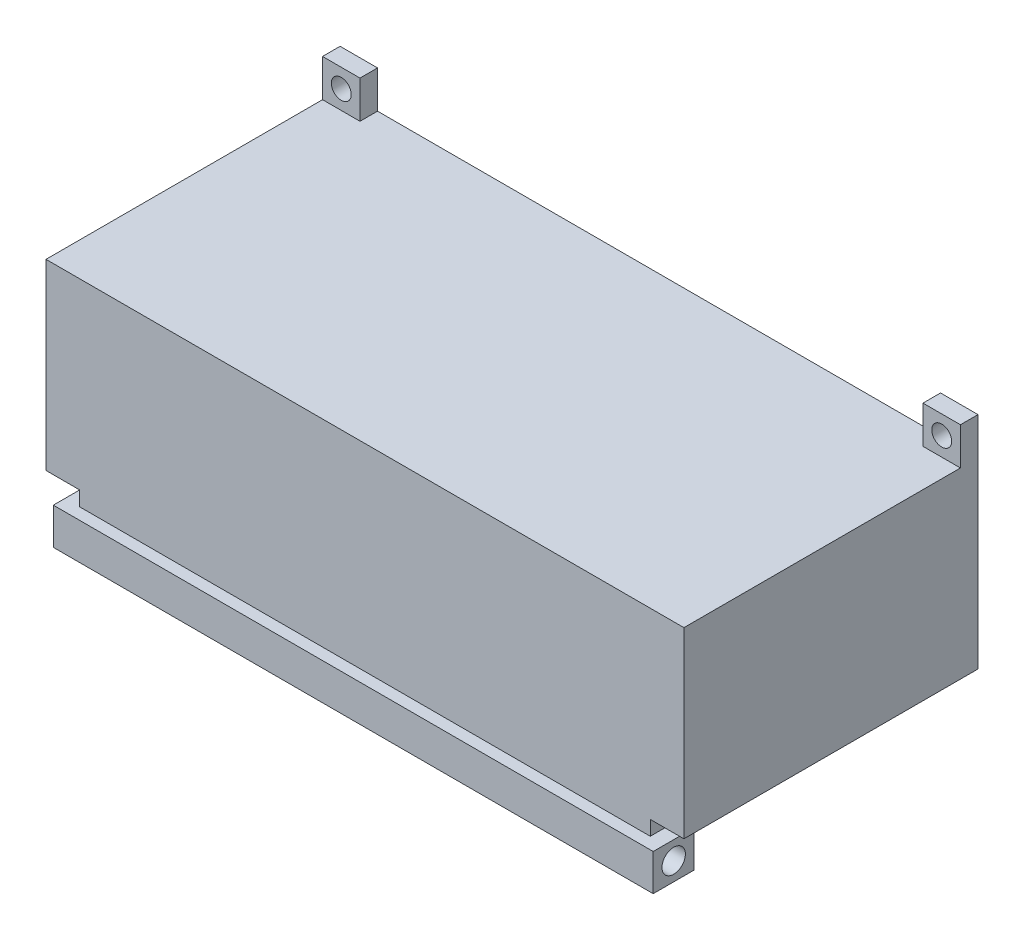
ISO-10303-21;
HEADER;
FILE_DESCRIPTION(('STEP AP214'),'2;1');
FILE_NAME('part.step','',(''),(''),'','','');
FILE_SCHEMA(('AUTOMOTIVE_DESIGN { 1 0 10303 214 1 1 1 1 }'));
ENDSEC;
DATA;
#1=APPLICATION_CONTEXT('core data for automotive mechanical design processes');
#2=APPLICATION_PROTOCOL_DEFINITION('international standard','automotive_design',2000,#1);
#3=PRODUCT_CONTEXT('',#1,'mechanical');
#4=PRODUCT('Part','Part','',(#3));
#5=PRODUCT_RELATED_PRODUCT_CATEGORY('part','',(#4));
#6=PRODUCT_DEFINITION_FORMATION('','',#4);
#7=PRODUCT_DEFINITION_CONTEXT('part definition',#1,'design');
#8=PRODUCT_DEFINITION('design','',#6,#7);
#9=PRODUCT_DEFINITION_SHAPE('','',#8);
#10=(LENGTH_UNIT() NAMED_UNIT(*) SI_UNIT(.MILLI.,.METRE.));
#11=(NAMED_UNIT(*) PLANE_ANGLE_UNIT() SI_UNIT($,.RADIAN.));
#12=(NAMED_UNIT(*) SI_UNIT($,.STERADIAN.) SOLID_ANGLE_UNIT());
#13=UNCERTAINTY_MEASURE_WITH_UNIT(LENGTH_MEASURE(1.E-05),#10,'distance_accuracy_value','');
#14=(GEOMETRIC_REPRESENTATION_CONTEXT(3) GLOBAL_UNCERTAINTY_ASSIGNED_CONTEXT((#13)) GLOBAL_UNIT_ASSIGNED_CONTEXT((#10,
#11,#12)) REPRESENTATION_CONTEXT('',''));
#15=CARTESIAN_POINT('',(0.,0.,0.));
#16=DIRECTION('',(0.,0.,1.));
#17=DIRECTION('',(1.,0.,0.));
#18=AXIS2_PLACEMENT_3D('',#15,#16,#17);
#19=CARTESIAN_POINT('',(0.,152.866347951903,47.25));
#20=DIRECTION('',(0.,0.,-1.));
#21=DIRECTION('',(-1.,0.,0.));
#22=AXIS2_PLACEMENT_3D('',#19,#20,#21);
#23=PLANE('',#22);
#24=DIRECTION('',(0.,-1.,0.));
#25=VECTOR('',#24,1.);
#26=CARTESIAN_POINT('',(8.25,152.866347951903,47.25));
#27=LINE('',#26,#25);
#28=CARTESIAN_POINT('',(8.25,1.8021243444677,47.25));
#29=VERTEX_POINT('',#28);
#30=CARTESIAN_POINT('',(8.25,0.,47.25));
#31=VERTEX_POINT('',#30);
#32=EDGE_CURVE('E252',#29,#31,#27,.T.);
#33=ORIENTED_EDGE('',*,*,#32,.F.);
#34=DIRECTION('',(-1.,0.,0.));
#35=VECTOR('',#34,1.);
#36=CARTESIAN_POINT('',(10.25,1.8021243444677,47.25));
#37=LINE('',#36,#35);
#38=CARTESIAN_POINT('',(10.25,1.8021243444677,47.25));
#39=VERTEX_POINT('',#38);
#40=EDGE_CURVE('E12',#29,#39,#37,.F.);
#41=ORIENTED_EDGE('',*,*,#40,.T.);
#42=DIRECTION('',(0.,1.,0.));
#43=VECTOR('',#42,1.);
#44=CARTESIAN_POINT('',(10.25,152.866347951903,47.25));
#45=LINE('',#44,#43);
#46=CARTESIAN_POINT('',(10.25,4.4478756555323,47.25));
#47=VERTEX_POINT('',#46);
#48=EDGE_CURVE('E237',#39,#47,#45,.T.);
#49=ORIENTED_EDGE('',*,*,#48,.T.);
#50=DIRECTION('',(-1.,0.,0.));
#51=VECTOR('',#50,1.);
#52=CARTESIAN_POINT('',(10.25,4.4478756555323,47.25));
#53=LINE('',#52,#51);
#54=CARTESIAN_POINT('',(8.25,4.4478756555323,47.25));
#55=VERTEX_POINT('',#54);
#56=EDGE_CURVE('E49',#47,#55,#53,.T.);
#57=ORIENTED_EDGE('',*,*,#56,.T.);
#58=CARTESIAN_POINT('',(8.25,37.,47.25));
#59=VERTEX_POINT('',#58);
#60=EDGE_CURVE('E258',#59,#55,#27,.T.);
#61=ORIENTED_EDGE('',*,*,#60,.F.);
#62=DIRECTION('',(-1.,0.,0.));
#63=VECTOR('',#62,1.);
#64=CARTESIAN_POINT('',(0.,37.,47.25));
#65=LINE('',#64,#63);
#66=CARTESIAN_POINT('',(100.75,37.,47.25));
#67=VERTEX_POINT('',#66);
#68=EDGE_CURVE('E368',#67,#59,#65,.T.);
#69=ORIENTED_EDGE('',*,*,#68,.F.);
#70=DIRECTION('',(0.,-1.,0.));
#71=VECTOR('',#70,1.);
#72=CARTESIAN_POINT('',(100.75,152.866347951903,47.25));
#73=LINE('',#72,#71);
#74=CARTESIAN_POINT('',(100.75,4.4478756555323,47.25));
#75=VERTEX_POINT('',#74);
#76=EDGE_CURVE('E259',#67,#75,#73,.T.);
#77=ORIENTED_EDGE('',*,*,#76,.T.);
#78=DIRECTION('',(1.,0.,0.));
#79=VECTOR('',#78,1.);
#80=CARTESIAN_POINT('',(98.75,4.4478756555323,47.25));
#81=LINE('',#80,#79);
#82=CARTESIAN_POINT('',(98.75,4.4478756555323,47.25));
#83=VERTEX_POINT('',#82);
#84=EDGE_CURVE('E63',#83,#75,#81,.T.);
#85=ORIENTED_EDGE('',*,*,#84,.F.);
#86=DIRECTION('',(0.,-1.,0.));
#87=VECTOR('',#86,1.);
#88=CARTESIAN_POINT('',(98.75,152.866347951903,47.25));
#89=LINE('',#88,#87);
#90=CARTESIAN_POINT('',(98.75,1.8021243444677,47.25));
#91=VERTEX_POINT('',#90);
#92=EDGE_CURVE('E241',#83,#91,#89,.T.);
#93=ORIENTED_EDGE('',*,*,#92,.T.);
#94=DIRECTION('',(1.,0.,0.));
#95=VECTOR('',#94,1.);
#96=CARTESIAN_POINT('',(98.75,1.8021243444677,47.25));
#97=LINE('',#96,#95);
#98=CARTESIAN_POINT('',(100.75,1.8021243444677,47.25));
#99=VERTEX_POINT('',#98);
#100=EDGE_CURVE('E432',#99,#91,#97,.F.);
#101=ORIENTED_EDGE('',*,*,#100,.F.);
#102=CARTESIAN_POINT('',(100.75,0.,47.25));
#103=VERTEX_POINT('',#102);
#104=EDGE_CURVE('E264',#99,#103,#73,.T.);
#105=ORIENTED_EDGE('',*,*,#104,.T.);
#106=DIRECTION('',(1.,0.,0.));
#107=VECTOR('',#106,1.);
#108=CARTESIAN_POINT('',(0.,0.,47.25));
#109=LINE('',#108,#107);
#110=EDGE_CURVE('E254',#31,#103,#109,.T.);
#111=ORIENTED_EDGE('',*,*,#110,.F.);
#112=EDGE_LOOP('',(#33,#41,#49,#57,#61,#69,#77,#85,#93,#101,#105,#111));
#113=FACE_BOUND('',#112,.T.);
#114=ADVANCED_FACE('F41',(#113),#23,.T.);
#115=CARTESIAN_POINT('',(0.,0.,50.25));
#116=DIRECTION('',(0.,0.,-1.));
#117=DIRECTION('',(-1.,0.,0.));
#118=AXIS2_PLACEMENT_3D('',#115,#116,#117);
#119=PLANE('',#118);
#120=DIRECTION('',(-1.,0.,0.));
#121=VECTOR('',#120,1.);
#122=CARTESIAN_POINT('',(3.25,6.25,50.25));
#123=LINE('',#122,#121);
#124=CARTESIAN_POINT('',(103.25,6.25,50.25));
#125=VERTEX_POINT('',#124);
#126=CARTESIAN_POINT('',(5.75,6.25,50.25));
#127=VERTEX_POINT('',#126);
#128=EDGE_CURVE('E355',#125,#127,#123,.T.);
#129=ORIENTED_EDGE('',*,*,#128,.F.);
#130=DIRECTION('',(0.,1.,0.));
#131=VECTOR('',#130,1.);
#132=CARTESIAN_POINT('',(103.25,6.25,50.25));
#133=LINE('',#132,#131);
#134=CARTESIAN_POINT('',(103.25,8.75,50.25));
#135=VERTEX_POINT('',#134);
#136=EDGE_CURVE('E304',#125,#135,#133,.T.);
#137=ORIENTED_EDGE('',*,*,#136,.T.);
#138=DIRECTION('',(1.,0.,0.));
#139=VECTOR('',#138,1.);
#140=CARTESIAN_POINT('',(109.,8.75,50.25));
#141=LINE('',#140,#139);
#142=CARTESIAN_POINT('',(109.,8.75,50.25));
#143=VERTEX_POINT('',#142);
#144=EDGE_CURVE('E306',#135,#143,#141,.T.);
#145=ORIENTED_EDGE('',*,*,#144,.T.);
#146=DIRECTION('',(0.,1.,0.));
#147=VECTOR('',#146,1.);
#148=CARTESIAN_POINT('',(109.,8.75,50.25));
#149=LINE('',#148,#147);
#150=CARTESIAN_POINT('',(109.,40.,50.25));
#151=VERTEX_POINT('',#150);
#152=EDGE_CURVE('E292',#143,#151,#149,.T.);
#153=ORIENTED_EDGE('',*,*,#152,.T.);
#154=DIRECTION('',(-1.,0.,0.));
#155=VECTOR('',#154,1.);
#156=CARTESIAN_POINT('',(0.,40.,50.25));
#157=LINE('',#156,#155);
#158=CARTESIAN_POINT('',(0.,40.,50.25));
#159=VERTEX_POINT('',#158);
#160=EDGE_CURVE('E295',#151,#159,#157,.T.);
#161=ORIENTED_EDGE('',*,*,#160,.T.);
#162=DIRECTION('',(0.,-1.,0.));
#163=VECTOR('',#162,1.);
#164=CARTESIAN_POINT('',(0.,8.75,50.25));
#165=LINE('',#164,#163);
#166=CARTESIAN_POINT('',(0.,8.75,50.25));
#167=VERTEX_POINT('',#166);
#168=EDGE_CURVE('E298',#159,#167,#165,.T.);
#169=ORIENTED_EDGE('',*,*,#168,.T.);
#170=DIRECTION('',(1.,0.,0.));
#171=VECTOR('',#170,1.);
#172=CARTESIAN_POINT('',(0.,8.75,50.25));
#173=LINE('',#172,#171);
#174=CARTESIAN_POINT('',(5.75,8.75,50.25));
#175=VERTEX_POINT('',#174);
#176=EDGE_CURVE('E300',#167,#175,#173,.T.);
#177=ORIENTED_EDGE('',*,*,#176,.T.);
#178=DIRECTION('',(0.,-1.,0.));
#179=VECTOR('',#178,1.);
#180=CARTESIAN_POINT('',(5.75,6.25,50.25));
#181=LINE('',#180,#179);
#182=EDGE_CURVE('E302',#175,#127,#181,.T.);
#183=ORIENTED_EDGE('',*,*,#182,.T.);
#184=EDGE_LOOP('',(#129,#137,#145,#153,#161,#169,#177,#183));
#185=FACE_BOUND('',#184,.T.);
#186=ADVANCED_FACE('F531',(#185),#119,.F.);
#187=CARTESIAN_POINT('',(0.,40.,50.25));
#188=DIRECTION('',(0.,-1.,0.));
#189=DIRECTION('',(0.,0.,-1.));
#190=AXIS2_PLACEMENT_3D('',#187,#188,#189);
#191=PLANE('',#190);
#192=DIRECTION('',(-1.,0.,0.));
#193=VECTOR('',#192,1.);
#194=CARTESIAN_POINT('',(0.,40.,0.));
#195=LINE('',#194,#193);
#196=CARTESIAN_POINT('',(102.6,40.,0.));
#197=VERTEX_POINT('',#196);
#198=CARTESIAN_POINT('',(6.39999999999999,40.,0.));
#199=VERTEX_POINT('',#198);
#200=EDGE_CURVE('E310',#197,#199,#195,.T.);
#201=ORIENTED_EDGE('',*,*,#200,.T.);
#202=DIRECTION('',(0.,0.,-1.));
#203=VECTOR('',#202,1.);
#204=CARTESIAN_POINT('',(6.39999999999999,40.,3.));
#205=LINE('',#204,#203);
#206=CARTESIAN_POINT('',(6.39999999999999,40.,3.));
#207=VERTEX_POINT('',#206);
#208=EDGE_CURVE('E467',#207,#199,#205,.T.);
#209=ORIENTED_EDGE('',*,*,#208,.F.);
#210=DIRECTION('',(1.,0.,0.));
#211=VECTOR('',#210,1.);
#212=CARTESIAN_POINT('',(0.,40.,3.));
#213=LINE('',#212,#211);
#214=CARTESIAN_POINT('',(0.,40.,3.));
#215=VERTEX_POINT('',#214);
#216=EDGE_CURVE('E443',#215,#207,#213,.T.);
#217=ORIENTED_EDGE('',*,*,#216,.F.);
#218=DIRECTION('',(0.,0.,-1.));
#219=VECTOR('',#218,1.);
#220=CARTESIAN_POINT('',(0.,40.,50.25));
#221=LINE('',#220,#219);
#222=EDGE_CURVE('E347',#159,#215,#221,.T.);
#223=ORIENTED_EDGE('',*,*,#222,.F.);
#224=ORIENTED_EDGE('',*,*,#160,.F.);
#225=DIRECTION('',(0.,0.,-1.));
#226=VECTOR('',#225,1.);
#227=CARTESIAN_POINT('',(109.,40.,50.25));
#228=LINE('',#227,#226);
#229=CARTESIAN_POINT('',(109.,40.,3.));
#230=VERTEX_POINT('',#229);
#231=EDGE_CURVE('E350',#151,#230,#228,.T.);
#232=ORIENTED_EDGE('',*,*,#231,.T.);
#233=DIRECTION('',(1.,0.,0.));
#234=VECTOR('',#233,1.);
#235=CARTESIAN_POINT('',(0.,40.,3.));
#236=LINE('',#235,#234);
#237=CARTESIAN_POINT('',(102.6,40.,3.));
#238=VERTEX_POINT('',#237);
#239=EDGE_CURVE('E485',#238,#230,#236,.T.);
#240=ORIENTED_EDGE('',*,*,#239,.F.);
#241=DIRECTION('',(0.,0.,-1.));
#242=VECTOR('',#241,1.);
#243=CARTESIAN_POINT('',(102.6,40.,3.));
#244=LINE('',#243,#242);
#245=EDGE_CURVE('E397',#238,#197,#244,.T.);
#246=ORIENTED_EDGE('',*,*,#245,.T.);
#247=EDGE_LOOP('',(#201,#209,#217,#223,#224,#232,#240,#246));
#248=FACE_BOUND('',#247,.T.);
#249=ADVANCED_FACE('F514',(#248),#191,.F.);
#250=CARTESIAN_POINT('',(5.75,6.25,50.25));
#251=DIRECTION('',(1.,0.,0.));
#252=DIRECTION('',(0.,0.,-1.));
#253=AXIS2_PLACEMENT_3D('',#250,#251,#252);
#254=PLANE('',#253);
#255=DIRECTION('',(0.,1.,0.));
#256=VECTOR('',#255,1.);
#257=CARTESIAN_POINT('',(5.75,6.25,45.25));
#258=LINE('',#257,#256);
#259=CARTESIAN_POINT('',(5.75,6.25,45.25));
#260=VERTEX_POINT('',#259);
#261=CARTESIAN_POINT('',(5.75,8.75,45.25));
#262=VERTEX_POINT('',#261);
#263=EDGE_CURVE('E287',#260,#262,#258,.T.);
#264=ORIENTED_EDGE('',*,*,#263,.F.);
#265=DIRECTION('',(0.,0.,-1.));
#266=VECTOR('',#265,1.);
#267=CARTESIAN_POINT('',(5.75,6.25,50.25));
#268=LINE('',#267,#266);
#269=EDGE_CURVE('E338',#127,#260,#268,.T.);
#270=ORIENTED_EDGE('',*,*,#269,.F.);
#271=ORIENTED_EDGE('',*,*,#182,.F.);
#272=DIRECTION('',(0.,0.,-1.));
#273=VECTOR('',#272,1.);
#274=CARTESIAN_POINT('',(5.75,8.75,50.25));
#275=LINE('',#274,#273);
#276=EDGE_CURVE('E341',#175,#262,#275,.T.);
#277=ORIENTED_EDGE('',*,*,#276,.T.);
#278=EDGE_LOOP('',(#264,#270,#271,#277));
#279=FACE_BOUND('',#278,.T.);
#280=ADVANCED_FACE('F593',(#279),#254,.F.);
#281=CARTESIAN_POINT('',(3.25,0.,50.25));
#282=DIRECTION('',(1.,0.,0.));
#283=DIRECTION('',(0.,0.,-1.));
#284=AXIS2_PLACEMENT_3D('',#281,#282,#283);
#285=PLANE('',#284);
#286=CARTESIAN_POINT('',(3.25,3.125,48.75));
#287=DIRECTION('',(1.,0.,0.));
#288=DIRECTION('',(0.,0.,-1.));
#289=AXIS2_PLACEMENT_3D('',#286,#287,#288);
#290=CIRCLE('',#289,2.);
#291=CARTESIAN_POINT('',(3.25,3.125,46.75));
#292=VERTEX_POINT('',#291);
#293=EDGE_CURVE('E248',#292,#292,#290,.T.);
#294=ORIENTED_EDGE('',*,*,#293,.T.);
#295=EDGE_LOOP('',(#294));
#296=FACE_BOUND('',#295,.T.);
#297=DIRECTION('',(0.,-1.,0.));
#298=VECTOR('',#297,1.);
#299=CARTESIAN_POINT('',(3.25,152.866347951903,45.25));
#300=LINE('',#299,#298);
#301=CARTESIAN_POINT('',(3.25,6.25000000000001,45.25));
#302=VERTEX_POINT('',#301);
#303=CARTESIAN_POINT('',(3.25,0.,45.25));
#304=VERTEX_POINT('',#303);
#305=EDGE_CURVE('E411',#302,#304,#300,.T.);
#306=ORIENTED_EDGE('',*,*,#305,.T.);
#307=DIRECTION('',(0.,0.,-1.));
#308=VECTOR('',#307,1.);
#309=CARTESIAN_POINT('',(3.25,0.,50.25));
#310=LINE('',#309,#308);
#311=CARTESIAN_POINT('',(3.25,0.,52.25));
#312=VERTEX_POINT('',#311);
#313=EDGE_CURVE('E332',#312,#304,#310,.T.);
#314=ORIENTED_EDGE('',*,*,#313,.F.);
#315=DIRECTION('',(0.,-1.,0.));
#316=VECTOR('',#315,1.);
#317=CARTESIAN_POINT('',(3.25,0.,52.25));
#318=LINE('',#317,#316);
#319=CARTESIAN_POINT('',(3.25,6.25,52.25));
#320=VERTEX_POINT('',#319);
#321=EDGE_CURVE('E426',#320,#312,#318,.T.);
#322=ORIENTED_EDGE('',*,*,#321,.F.);
#323=DIRECTION('',(0.,0.,-1.));
#324=VECTOR('',#323,1.);
#325=CARTESIAN_POINT('',(3.25,6.25,50.25));
#326=LINE('',#325,#324);
#327=EDGE_CURVE('E335',#320,#302,#326,.T.);
#328=ORIENTED_EDGE('',*,*,#327,.T.);
#329=EDGE_LOOP('',(#306,#314,#322,#328));
#330=FACE_BOUND('',#329,.T.);
#331=ADVANCED_FACE('F425',(#296,#330),#285,.F.);
#332=CARTESIAN_POINT('',(3.25,0.,50.25));
#333=DIRECTION('',(0.,1.,0.));
#334=DIRECTION('',(0.,0.,1.));
#335=AXIS2_PLACEMENT_3D('',#332,#333,#334);
#336=PLANE('',#335);
#337=DIRECTION('',(1.,0.,0.));
#338=VECTOR('',#337,1.);
#339=CARTESIAN_POINT('',(0.,0.,45.25));
#340=LINE('',#339,#338);
#341=CARTESIAN_POINT('',(100.75,0.,45.25));
#342=VERTEX_POINT('',#341);
#343=CARTESIAN_POINT('',(105.75,0.,45.25));
#344=VERTEX_POINT('',#343);
#345=EDGE_CURVE('E393',#342,#344,#340,.T.);
#346=ORIENTED_EDGE('',*,*,#345,.T.);
#347=DIRECTION('',(0.,0.,-1.));
#348=VECTOR('',#347,1.);
#349=CARTESIAN_POINT('',(105.75,0.,50.25));
#350=LINE('',#349,#348);
#351=CARTESIAN_POINT('',(105.75,0.,52.25));
#352=VERTEX_POINT('',#351);
#353=EDGE_CURVE('E329',#352,#344,#350,.T.);
#354=ORIENTED_EDGE('',*,*,#353,.F.);
#355=DIRECTION('',(1.,0.,0.));
#356=VECTOR('',#355,1.);
#357=CARTESIAN_POINT('',(3.25,0.,52.25));
#358=LINE('',#357,#356);
#359=EDGE_CURVE('E422',#312,#352,#358,.T.);
#360=ORIENTED_EDGE('',*,*,#359,.F.);
#361=ORIENTED_EDGE('',*,*,#313,.T.);
#362=DIRECTION('',(1.,0.,0.));
#363=VECTOR('',#362,1.);
#364=CARTESIAN_POINT('',(0.,0.,45.25));
#365=LINE('',#364,#363);
#366=CARTESIAN_POINT('',(8.25,0.,45.25));
#367=VERTEX_POINT('',#366);
#368=EDGE_CURVE('E271',#304,#367,#365,.T.);
#369=ORIENTED_EDGE('',*,*,#368,.T.);
#370=DIRECTION('',(0.,0.,1.));
#371=VECTOR('',#370,1.);
#372=CARTESIAN_POINT('',(8.25,0.,0.));
#373=LINE('',#372,#371);
#374=EDGE_CURVE('E401',#367,#31,#373,.T.);
#375=ORIENTED_EDGE('',*,*,#374,.T.);
#376=ORIENTED_EDGE('',*,*,#110,.T.);
#377=DIRECTION('',(0.,0.,1.));
#378=VECTOR('',#377,1.);
#379=CARTESIAN_POINT('',(100.75,0.,0.));
#380=LINE('',#379,#378);
#381=EDGE_CURVE('E396',#342,#103,#380,.T.);
#382=ORIENTED_EDGE('',*,*,#381,.F.);
#383=EDGE_LOOP('',(#346,#354,#360,#361,#369,#375,#376,#382));
#384=FACE_BOUND('',#383,.T.);
#385=ADVANCED_FACE('F419',(#384),#336,.F.);
#386=CARTESIAN_POINT('',(105.75,0.,50.25));
#387=DIRECTION('',(-1.,0.,0.));
#388=DIRECTION('',(0.,0.,1.));
#389=AXIS2_PLACEMENT_3D('',#386,#387,#388);
#390=PLANE('',#389);
#391=CARTESIAN_POINT('',(105.75,3.125,48.75));
#392=DIRECTION('',(1.,0.,0.));
#393=DIRECTION('',(0.,0.,-1.));
#394=AXIS2_PLACEMENT_3D('',#391,#392,#393);
#395=CIRCLE('',#394,2.);
#396=CARTESIAN_POINT('',(105.75,3.125,46.75));
#397=VERTEX_POINT('',#396);
#398=EDGE_CURVE('E826',#397,#397,#395,.T.);
#399=ORIENTED_EDGE('',*,*,#398,.F.);
#400=EDGE_LOOP('',(#399));
#401=FACE_BOUND('',#400,.T.);
#402=DIRECTION('',(0.,-1.,0.));
#403=VECTOR('',#402,1.);
#404=CARTESIAN_POINT('',(105.75,152.866347951903,45.25));
#405=LINE('',#404,#403);
#406=CARTESIAN_POINT('',(105.75,6.25000000000001,45.25));
#407=VERTEX_POINT('',#406);
#408=EDGE_CURVE('E378',#407,#344,#405,.T.);
#409=ORIENTED_EDGE('',*,*,#408,.F.);
#410=DIRECTION('',(0.,0.,-1.));
#411=VECTOR('',#410,1.);
#412=CARTESIAN_POINT('',(105.75,6.25,50.25));
#413=LINE('',#412,#411);
#414=CARTESIAN_POINT('',(105.75,6.25,52.25));
#415=VERTEX_POINT('',#414);
#416=EDGE_CURVE('E326',#415,#407,#413,.T.);
#417=ORIENTED_EDGE('',*,*,#416,.F.);
#418=DIRECTION('',(0.,1.,0.));
#419=VECTOR('',#418,1.);
#420=CARTESIAN_POINT('',(105.75,0.,52.25));
#421=LINE('',#420,#419);
#422=EDGE_CURVE('E430',#352,#415,#421,.T.);
#423=ORIENTED_EDGE('',*,*,#422,.F.);
#424=ORIENTED_EDGE('',*,*,#353,.T.);
#425=EDGE_LOOP('',(#409,#417,#423,#424));
#426=FACE_BOUND('',#425,.T.);
#427=ADVANCED_FACE('F584',(#401,#426),#390,.F.);
#428=CARTESIAN_POINT('',(105.75,6.25,50.25));
#429=DIRECTION('',(0.,-1.,0.));
#430=DIRECTION('',(1.,0.,0.));
#431=AXIS2_PLACEMENT_3D('',#428,#429,#430);
#432=PLANE('',#431);
#433=DIRECTION('',(1.,0.,0.));
#434=VECTOR('',#433,1.);
#435=CARTESIAN_POINT('',(105.75,6.25,45.25));
#436=LINE('',#435,#434);
#437=CARTESIAN_POINT('',(103.25,6.25,45.25));
#438=VERTEX_POINT('',#437);
#439=EDGE_CURVE('E283',#438,#407,#436,.T.);
#440=ORIENTED_EDGE('',*,*,#439,.F.);
#441=DIRECTION('',(0.,0.,-1.));
#442=VECTOR('',#441,1.);
#443=CARTESIAN_POINT('',(103.25,6.25,50.25));
#444=LINE('',#443,#442);
#445=EDGE_CURVE('E323',#125,#438,#444,.T.);
#446=ORIENTED_EDGE('',*,*,#445,.F.);
#447=ORIENTED_EDGE('',*,*,#128,.T.);
#448=ORIENTED_EDGE('',*,*,#269,.T.);
#449=DIRECTION('',(1.,0.,0.));
#450=VECTOR('',#449,1.);
#451=CARTESIAN_POINT('',(3.25,6.25,45.25));
#452=LINE('',#451,#450);
#453=EDGE_CURVE('E285',#302,#260,#452,.T.);
#454=ORIENTED_EDGE('',*,*,#453,.F.);
#455=ORIENTED_EDGE('',*,*,#327,.F.);
#456=DIRECTION('',(-1.,0.,0.));
#457=VECTOR('',#456,1.);
#458=CARTESIAN_POINT('',(3.25,6.25,52.25));
#459=LINE('',#458,#457);
#460=EDGE_CURVE('E438',#415,#320,#459,.T.);
#461=ORIENTED_EDGE('',*,*,#460,.F.);
#462=ORIENTED_EDGE('',*,*,#416,.T.);
#463=EDGE_LOOP('',(#440,#446,#447,#448,#454,#455,#461,#462));
#464=FACE_BOUND('',#463,.T.);
#465=ADVANCED_FACE('F580',(#464),#432,.F.);
#466=CARTESIAN_POINT('',(103.25,6.25,50.25));
#467=DIRECTION('',(-1.,0.,0.));
#468=DIRECTION('',(0.,0.,1.));
#469=AXIS2_PLACEMENT_3D('',#466,#467,#468);
#470=PLANE('',#469);
#471=DIRECTION('',(0.,-1.,0.));
#472=VECTOR('',#471,1.);
#473=CARTESIAN_POINT('',(103.25,6.25,45.25));
#474=LINE('',#473,#472);
#475=CARTESIAN_POINT('',(103.25,8.75,45.25));
#476=VERTEX_POINT('',#475);
#477=EDGE_CURVE('E281',#476,#438,#474,.T.);
#478=ORIENTED_EDGE('',*,*,#477,.F.);
#479=DIRECTION('',(0.,0.,-1.));
#480=VECTOR('',#479,1.);
#481=CARTESIAN_POINT('',(103.25,8.75,50.25));
#482=LINE('',#481,#480);
#483=EDGE_CURVE('E320',#135,#476,#482,.T.);
#484=ORIENTED_EDGE('',*,*,#483,.F.);
#485=ORIENTED_EDGE('',*,*,#136,.F.);
#486=ORIENTED_EDGE('',*,*,#445,.T.);
#487=EDGE_LOOP('',(#478,#484,#485,#486));
#488=FACE_BOUND('',#487,.T.);
#489=ADVANCED_FACE('F576',(#488),#470,.F.);
#490=CARTESIAN_POINT('',(109.,8.75,50.25));
#491=DIRECTION('',(0.,1.,0.));
#492=DIRECTION('',(-1.,0.,0.));
#493=AXIS2_PLACEMENT_3D('',#490,#491,#492);
#494=PLANE('',#493);
#495=DIRECTION('',(-1.,0.,0.));
#496=VECTOR('',#495,1.);
#497=CARTESIAN_POINT('',(109.,8.75,45.25));
#498=LINE('',#497,#496);
#499=CARTESIAN_POINT('',(105.75,8.75000000000001,45.25));
#500=VERTEX_POINT('',#499);
#501=EDGE_CURVE('E353',#500,#476,#498,.T.);
#502=ORIENTED_EDGE('',*,*,#501,.F.);
#503=DIRECTION('',(0.,0.,-1.));
#504=VECTOR('',#503,1.);
#505=CARTESIAN_POINT('',(105.75,8.75,50.25));
#506=LINE('',#505,#504);
#507=CARTESIAN_POINT('',(105.75,8.75000000000001,0.));
#508=VERTEX_POINT('',#507);
#509=EDGE_CURVE('E278',#500,#508,#506,.T.);
#510=ORIENTED_EDGE('',*,*,#509,.T.);
#511=DIRECTION('',(1.,0.,0.));
#512=VECTOR('',#511,1.);
#513=CARTESIAN_POINT('',(109.,8.75,0.));
#514=LINE('',#513,#512);
#515=CARTESIAN_POINT('',(109.,8.75,0.));
#516=VERTEX_POINT('',#515);
#517=EDGE_CURVE('E296',#508,#516,#514,.T.);
#518=ORIENTED_EDGE('',*,*,#517,.T.);
#519=DIRECTION('',(0.,0.,-1.));
#520=VECTOR('',#519,1.);
#521=CARTESIAN_POINT('',(109.,8.75,50.25));
#522=LINE('',#521,#520);
#523=EDGE_CURVE('E308',#143,#516,#522,.T.);
#524=ORIENTED_EDGE('',*,*,#523,.F.);
#525=ORIENTED_EDGE('',*,*,#144,.F.);
#526=ORIENTED_EDGE('',*,*,#483,.T.);
#527=EDGE_LOOP('',(#502,#510,#518,#524,#525,#526));
#528=FACE_BOUND('',#527,.T.);
#529=ADVANCED_FACE('F573',(#528),#494,.F.);
#530=CARTESIAN_POINT('',(109.,8.75,50.25));
#531=DIRECTION('',(-1.,0.,0.));
#532=DIRECTION('',(0.,0.,1.));
#533=AXIS2_PLACEMENT_3D('',#530,#531,#532);
#534=PLANE('',#533);
#535=DIRECTION('',(0.,1.,0.));
#536=VECTOR('',#535,1.);
#537=CARTESIAN_POINT('',(109.,8.75,0.));
#538=LINE('',#537,#536);
#539=CARTESIAN_POINT('',(109.,46.4,0.));
#540=VERTEX_POINT('',#539);
#541=EDGE_CURVE('E291',#516,#540,#538,.T.);
#542=ORIENTED_EDGE('',*,*,#541,.T.);
#543=DIRECTION('',(0.,0.,-1.));
#544=VECTOR('',#543,1.);
#545=CARTESIAN_POINT('',(109.,46.4,3.));
#546=LINE('',#545,#544);
#547=CARTESIAN_POINT('',(109.,46.4,3.));
#548=VERTEX_POINT('',#547);
#549=EDGE_CURVE('E493',#548,#540,#546,.T.);
#550=ORIENTED_EDGE('',*,*,#549,.F.);
#551=DIRECTION('',(0.,1.,0.));
#552=VECTOR('',#551,1.);
#553=CARTESIAN_POINT('',(109.,0.,3.));
#554=LINE('',#553,#552);
#555=EDGE_CURVE('E483',#230,#548,#554,.T.);
#556=ORIENTED_EDGE('',*,*,#555,.F.);
#557=ORIENTED_EDGE('',*,*,#231,.F.);
#558=ORIENTED_EDGE('',*,*,#152,.F.);
#559=ORIENTED_EDGE('',*,*,#523,.T.);
#560=EDGE_LOOP('',(#542,#550,#556,#557,#558,#559));
#561=FACE_BOUND('',#560,.T.);
#562=ADVANCED_FACE('F43',(#561),#534,.F.);
#563=CARTESIAN_POINT('',(0.,8.75,50.25));
#564=DIRECTION('',(1.,0.,0.));
#565=DIRECTION('',(0.,0.,-1.));
#566=AXIS2_PLACEMENT_3D('',#563,#564,#565);
#567=PLANE('',#566);
#568=DIRECTION('',(0.,-1.,0.));
#569=VECTOR('',#568,1.);
#570=CARTESIAN_POINT('',(0.,8.75,0.));
#571=LINE('',#570,#569);
#572=CARTESIAN_POINT('',(0.,46.4,0.));
#573=VERTEX_POINT('',#572);
#574=CARTESIAN_POINT('',(0.,8.75,0.));
#575=VERTEX_POINT('',#574);
#576=EDGE_CURVE('E312',#573,#575,#571,.T.);
#577=ORIENTED_EDGE('',*,*,#576,.T.);
#578=DIRECTION('',(0.,0.,-1.));
#579=VECTOR('',#578,1.);
#580=CARTESIAN_POINT('',(0.,8.75,50.25));
#581=LINE('',#580,#579);
#582=EDGE_CURVE('E344',#167,#575,#581,.T.);
#583=ORIENTED_EDGE('',*,*,#582,.F.);
#584=ORIENTED_EDGE('',*,*,#168,.F.);
#585=ORIENTED_EDGE('',*,*,#222,.T.);
#586=DIRECTION('',(0.,1.,0.));
#587=VECTOR('',#586,1.);
#588=CARTESIAN_POINT('',(0.,0.,3.));
#589=LINE('',#588,#587);
#590=CARTESIAN_POINT('',(0.,46.4,3.));
#591=VERTEX_POINT('',#590);
#592=EDGE_CURVE('E446',#215,#591,#589,.T.);
#593=ORIENTED_EDGE('',*,*,#592,.T.);
#594=DIRECTION('',(0.,0.,-1.));
#595=VECTOR('',#594,1.);
#596=CARTESIAN_POINT('',(0.,46.4,3.));
#597=LINE('',#596,#595);
#598=EDGE_CURVE('E459',#591,#573,#597,.T.);
#599=ORIENTED_EDGE('',*,*,#598,.T.);
#600=EDGE_LOOP('',(#577,#583,#584,#585,#593,#599));
#601=FACE_BOUND('',#600,.T.);
#602=ADVANCED_FACE('F527',(#601),#567,.F.);
#603=CARTESIAN_POINT('',(0.,8.75,50.25));
#604=DIRECTION('',(0.,1.,0.));
#605=DIRECTION('',(0.,0.,1.));
#606=AXIS2_PLACEMENT_3D('',#603,#604,#605);
#607=PLANE('',#606);
#608=DIRECTION('',(1.,0.,0.));
#609=VECTOR('',#608,1.);
#610=CARTESIAN_POINT('',(0.,8.75,0.));
#611=LINE('',#610,#609);
#612=CARTESIAN_POINT('',(3.25,8.75000000000001,0.));
#613=VERTEX_POINT('',#612);
#614=EDGE_CURVE('E314',#575,#613,#611,.T.);
#615=ORIENTED_EDGE('',*,*,#614,.T.);
#616=DIRECTION('',(0.,0.,1.));
#617=VECTOR('',#616,1.);
#618=CARTESIAN_POINT('',(3.25,8.75,50.25));
#619=LINE('',#618,#617);
#620=CARTESIAN_POINT('',(3.25,8.75000000000001,45.25));
#621=VERTEX_POINT('',#620);
#622=EDGE_CURVE('E274',#613,#621,#619,.T.);
#623=ORIENTED_EDGE('',*,*,#622,.T.);
#624=DIRECTION('',(-1.,0.,0.));
#625=VECTOR('',#624,1.);
#626=CARTESIAN_POINT('',(0.,8.75,45.25));
#627=LINE('',#626,#625);
#628=EDGE_CURVE('E289',#262,#621,#627,.T.);
#629=ORIENTED_EDGE('',*,*,#628,.F.);
#630=ORIENTED_EDGE('',*,*,#276,.F.);
#631=ORIENTED_EDGE('',*,*,#176,.F.);
#632=ORIENTED_EDGE('',*,*,#582,.T.);
#633=EDGE_LOOP('',(#615,#623,#629,#630,#631,#632));
#634=FACE_BOUND('',#633,.T.);
#635=ADVANCED_FACE('F572',(#634),#607,.F.);
#636=CARTESIAN_POINT('',(0.,0.,0.));
#637=DIRECTION('',(0.,0.,-1.));
#638=DIRECTION('',(-1.,0.,0.));
#639=AXIS2_PLACEMENT_3D('',#636,#637,#638);
#640=PLANE('',#639);
#641=DIRECTION('',(0.,-1.,0.));
#642=VECTOR('',#641,1.);
#643=CARTESIAN_POINT('',(105.75,152.866347951903,0.));
#644=LINE('',#643,#642);
#645=CARTESIAN_POINT('',(105.75,37.,0.));
#646=VERTEX_POINT('',#645);
#647=EDGE_CURVE('E405',#646,#508,#644,.T.);
#648=ORIENTED_EDGE('',*,*,#647,.F.);
#649=DIRECTION('',(-1.,0.,0.));
#650=VECTOR('',#649,1.);
#651=CARTESIAN_POINT('',(0.,37.,0.));
#652=LINE('',#651,#650);
#653=CARTESIAN_POINT('',(3.25,37.,0.));
#654=VERTEX_POINT('',#653);
#655=EDGE_CURVE('E387',#646,#654,#652,.T.);
#656=ORIENTED_EDGE('',*,*,#655,.T.);
#657=DIRECTION('',(0.,-1.,0.));
#658=VECTOR('',#657,1.);
#659=CARTESIAN_POINT('',(3.25,152.866347951903,0.));
#660=LINE('',#659,#658);
#661=EDGE_CURVE('E407',#654,#613,#660,.T.);
#662=ORIENTED_EDGE('',*,*,#661,.T.);
#663=ORIENTED_EDGE('',*,*,#614,.F.);
#664=ORIENTED_EDGE('',*,*,#576,.F.);
#665=DIRECTION('',(1.,0.,0.));
#666=VECTOR('',#665,1.);
#667=CARTESIAN_POINT('',(0.,46.4,0.));
#668=LINE('',#667,#666);
#669=CARTESIAN_POINT('',(6.39999999999999,46.4,0.));
#670=VERTEX_POINT('',#669);
#671=EDGE_CURVE('E440',#573,#670,#668,.T.);
#672=ORIENTED_EDGE('',*,*,#671,.T.);
#673=DIRECTION('',(0.,-1.,0.));
#674=VECTOR('',#673,1.);
#675=CARTESIAN_POINT('',(6.39999999999999,0.,0.));
#676=LINE('',#675,#674);
#677=EDGE_CURVE('E462',#670,#199,#676,.T.);
#678=ORIENTED_EDGE('',*,*,#677,.T.);
#679=ORIENTED_EDGE('',*,*,#200,.F.);
#680=DIRECTION('',(0.,-1.,0.));
#681=VECTOR('',#680,1.);
#682=CARTESIAN_POINT('',(102.6,0.,0.));
#683=LINE('',#682,#681);
#684=CARTESIAN_POINT('',(102.6,46.4,0.));
#685=VERTEX_POINT('',#684);
#686=EDGE_CURVE('E489',#685,#197,#683,.T.);
#687=ORIENTED_EDGE('',*,*,#686,.F.);
#688=DIRECTION('',(-1.,0.,0.));
#689=VECTOR('',#688,1.);
#690=CARTESIAN_POINT('',(0.,46.4,0.));
#691=LINE('',#690,#689);
#692=EDGE_CURVE('E479',#540,#685,#691,.T.);
#693=ORIENTED_EDGE('',*,*,#692,.F.);
#694=ORIENTED_EDGE('',*,*,#541,.F.);
#695=ORIENTED_EDGE('',*,*,#517,.F.);
#696=EDGE_LOOP('',(#648,#656,#662,#663,#664,#672,#678,#679,#687,#693,#694,#695));
#697=FACE_BOUND('',#696,.T.);
#698=CARTESIAN_POINT('',(105.8,43.2,0.));
#699=DIRECTION('',(0.,0.,-1.));
#700=DIRECTION('',(-1.,0.,0.));
#701=AXIS2_PLACEMENT_3D('',#698,#699,#700);
#702=CIRCLE('',#701,1.7);
#703=CARTESIAN_POINT('',(104.1,43.2,0.));
#704=VERTEX_POINT('',#703);
#705=EDGE_CURVE('E470',#704,#704,#702,.T.);
#706=ORIENTED_EDGE('',*,*,#705,.F.);
#707=EDGE_LOOP('',(#706));
#708=FACE_BOUND('',#707,.T.);
#709=CARTESIAN_POINT('',(3.19999999999999,43.2,0.));
#710=DIRECTION('',(0.,0.,-1.));
#711=DIRECTION('',(-1.,0.,0.));
#712=AXIS2_PLACEMENT_3D('',#709,#710,#711);
#713=CIRCLE('',#712,1.7);
#714=CARTESIAN_POINT('',(1.49999999999999,43.2,0.));
#715=VERTEX_POINT('',#714);
#716=EDGE_CURVE('E447',#715,#715,#713,.F.);
#717=ORIENTED_EDGE('',*,*,#716,.T.);
#718=EDGE_LOOP('',(#717));
#719=FACE_BOUND('',#718,.T.);
#720=ADVANCED_FACE('F509',(#697,#708,#719),#640,.T.);
#721=CARTESIAN_POINT('',(0.,152.866347951903,45.25));
#722=DIRECTION('',(0.,0.,-1.));
#723=DIRECTION('',(-1.,0.,0.));
#724=AXIS2_PLACEMENT_3D('',#721,#722,#723);
#725=PLANE('',#724);
#726=ORIENTED_EDGE('',*,*,#628,.T.);
#727=CARTESIAN_POINT('',(3.25,37.,45.25));
#728=VERTEX_POINT('',#727);
#729=EDGE_CURVE('E409',#728,#621,#300,.T.);
#730=ORIENTED_EDGE('',*,*,#729,.F.);
#731=DIRECTION('',(-1.,0.,0.));
#732=VECTOR('',#731,1.);
#733=CARTESIAN_POINT('',(0.,37.,45.25));
#734=LINE('',#733,#732);
#735=CARTESIAN_POINT('',(8.25,37.,45.25));
#736=VERTEX_POINT('',#735);
#737=EDGE_CURVE('E367',#736,#728,#734,.T.);
#738=ORIENTED_EDGE('',*,*,#737,.F.);
#739=DIRECTION('',(0.,-1.,0.));
#740=VECTOR('',#739,1.);
#741=CARTESIAN_POINT('',(8.25,152.866347951903,45.25));
#742=LINE('',#741,#740);
#743=EDGE_CURVE('E262',#736,#367,#742,.T.);
#744=ORIENTED_EDGE('',*,*,#743,.T.);
#745=ORIENTED_EDGE('',*,*,#368,.F.);
#746=ORIENTED_EDGE('',*,*,#305,.F.);
#747=ORIENTED_EDGE('',*,*,#453,.T.);
#748=ORIENTED_EDGE('',*,*,#263,.T.);
#749=EDGE_LOOP('',(#726,#730,#738,#744,#745,#746,#747,#748));
#750=FACE_BOUND('',#749,.T.);
#751=ADVANCED_FACE('F417',(#750),#725,.T.);
#752=CARTESIAN_POINT('',(0.,152.866347951903,45.25));
#753=DIRECTION('',(0.,0.,-1.));
#754=DIRECTION('',(-1.,0.,0.));
#755=AXIS2_PLACEMENT_3D('',#752,#753,#754);
#756=PLANE('',#755);
#757=ORIENTED_EDGE('',*,*,#439,.T.);
#758=ORIENTED_EDGE('',*,*,#408,.T.);
#759=ORIENTED_EDGE('',*,*,#345,.F.);
#760=DIRECTION('',(0.,-1.,0.));
#761=VECTOR('',#760,1.);
#762=CARTESIAN_POINT('',(100.75,152.866347951903,45.25));
#763=LINE('',#762,#761);
#764=CARTESIAN_POINT('',(100.75,37.,45.25));
#765=VERTEX_POINT('',#764);
#766=EDGE_CURVE('E269',#765,#342,#763,.T.);
#767=ORIENTED_EDGE('',*,*,#766,.F.);
#768=DIRECTION('',(-1.,0.,0.));
#769=VECTOR('',#768,1.);
#770=CARTESIAN_POINT('',(0.,37.,45.25));
#771=LINE('',#770,#769);
#772=CARTESIAN_POINT('',(105.75,37.,45.25));
#773=VERTEX_POINT('',#772);
#774=EDGE_CURVE('E275',#773,#765,#771,.T.);
#775=ORIENTED_EDGE('',*,*,#774,.F.);
#776=EDGE_CURVE('E375',#773,#500,#405,.T.);
#777=ORIENTED_EDGE('',*,*,#776,.T.);
#778=ORIENTED_EDGE('',*,*,#501,.T.);
#779=ORIENTED_EDGE('',*,*,#477,.T.);
#780=EDGE_LOOP('',(#757,#758,#759,#767,#775,#777,#778,#779));
#781=FACE_BOUND('',#780,.T.);
#782=ADVANCED_FACE('F565',(#781),#756,.T.);
#783=CARTESIAN_POINT('',(105.75,152.866347951903,0.));
#784=DIRECTION('',(1.,0.,0.));
#785=DIRECTION('',(0.,1.,0.));
#786=AXIS2_PLACEMENT_3D('',#783,#784,#785);
#787=PLANE('',#786);
#788=ORIENTED_EDGE('',*,*,#776,.F.);
#789=DIRECTION('',(0.,0.,-1.));
#790=VECTOR('',#789,1.);
#791=CARTESIAN_POINT('',(105.75,37.,0.));
#792=LINE('',#791,#790);
#793=EDGE_CURVE('E390',#773,#646,#792,.T.);
#794=ORIENTED_EDGE('',*,*,#793,.T.);
#795=ORIENTED_EDGE('',*,*,#647,.T.);
#796=ORIENTED_EDGE('',*,*,#509,.F.);
#797=EDGE_LOOP('',(#788,#794,#795,#796));
#798=FACE_BOUND('',#797,.T.);
#799=ADVANCED_FACE('F567',(#798),#787,.F.);
#800=CARTESIAN_POINT('',(3.25,152.866347951903,0.));
#801=DIRECTION('',(-1.,0.,0.));
#802=DIRECTION('',(0.,-1.,0.));
#803=AXIS2_PLACEMENT_3D('',#800,#801,#802);
#804=PLANE('',#803);
#805=ORIENTED_EDGE('',*,*,#661,.F.);
#806=DIRECTION('',(0.,0.,1.));
#807=VECTOR('',#806,1.);
#808=CARTESIAN_POINT('',(3.25,37.,0.));
#809=LINE('',#808,#807);
#810=EDGE_CURVE('E385',#654,#728,#809,.T.);
#811=ORIENTED_EDGE('',*,*,#810,.T.);
#812=ORIENTED_EDGE('',*,*,#729,.T.);
#813=ORIENTED_EDGE('',*,*,#622,.F.);
#814=EDGE_LOOP('',(#805,#811,#812,#813));
#815=FACE_BOUND('',#814,.T.);
#816=ADVANCED_FACE('F672',(#815),#804,.F.);
#817=CARTESIAN_POINT('',(8.25,152.866347951903,0.));
#818=DIRECTION('',(1.,0.,0.));
#819=DIRECTION('',(0.,1.,0.));
#820=AXIS2_PLACEMENT_3D('',#817,#818,#819);
#821=PLANE('',#820);
#822=ORIENTED_EDGE('',*,*,#60,.T.);
#823=CARTESIAN_POINT('',(8.25,3.125,48.75));
#824=DIRECTION('',(1.,0.,0.));
#825=DIRECTION('',(0.,1.,0.));
#826=AXIS2_PLACEMENT_3D('',#823,#824,#825);
#827=CIRCLE('',#826,2.);
#828=EDGE_CURVE('E247',#55,#29,#827,.F.);
#829=ORIENTED_EDGE('',*,*,#828,.T.);
#830=ORIENTED_EDGE('',*,*,#32,.T.);
#831=ORIENTED_EDGE('',*,*,#374,.F.);
#832=ORIENTED_EDGE('',*,*,#743,.F.);
#833=DIRECTION('',(0.,0.,-1.));
#834=VECTOR('',#833,1.);
#835=CARTESIAN_POINT('',(8.25,37.,0.));
#836=LINE('',#835,#834);
#837=EDGE_CURVE('E363',#59,#736,#836,.T.);
#838=ORIENTED_EDGE('',*,*,#837,.F.);
#839=EDGE_LOOP('',(#822,#829,#830,#831,#832,#838));
#840=FACE_BOUND('',#839,.T.);
#841=ADVANCED_FACE('F360',(#840),#821,.T.);
#842=CARTESIAN_POINT('',(100.75,152.866347951903,0.));
#843=DIRECTION('',(1.,0.,0.));
#844=DIRECTION('',(0.,1.,0.));
#845=AXIS2_PLACEMENT_3D('',#842,#843,#844);
#846=PLANE('',#845);
#847=ORIENTED_EDGE('',*,*,#104,.F.);
#848=CARTESIAN_POINT('',(100.75,3.125,48.75));
#849=DIRECTION('',(1.,0.,0.));
#850=DIRECTION('',(0.,1.,0.));
#851=AXIS2_PLACEMENT_3D('',#848,#849,#850);
#852=CIRCLE('',#851,2.);
#853=EDGE_CURVE('E356',#99,#75,#852,.T.);
#854=ORIENTED_EDGE('',*,*,#853,.T.);
#855=ORIENTED_EDGE('',*,*,#76,.F.);
#856=DIRECTION('',(0.,0.,-1.));
#857=VECTOR('',#856,1.);
#858=CARTESIAN_POINT('',(100.75,37.,0.));
#859=LINE('',#858,#857);
#860=EDGE_CURVE('E272',#67,#765,#859,.T.);
#861=ORIENTED_EDGE('',*,*,#860,.T.);
#862=ORIENTED_EDGE('',*,*,#766,.T.);
#863=ORIENTED_EDGE('',*,*,#381,.T.);
#864=EDGE_LOOP('',(#847,#854,#855,#861,#862,#863));
#865=FACE_BOUND('',#864,.T.);
#866=ADVANCED_FACE('F561',(#865),#846,.F.);
#867=CARTESIAN_POINT('',(0.,37.,50.25));
#868=DIRECTION('',(0.,-1.,0.));
#869=DIRECTION('',(0.,0.,-1.));
#870=AXIS2_PLACEMENT_3D('',#867,#868,#869);
#871=PLANE('',#870);
#872=ORIENTED_EDGE('',*,*,#793,.F.);
#873=ORIENTED_EDGE('',*,*,#774,.T.);
#874=ORIENTED_EDGE('',*,*,#860,.F.);
#875=ORIENTED_EDGE('',*,*,#68,.T.);
#876=ORIENTED_EDGE('',*,*,#837,.T.);
#877=ORIENTED_EDGE('',*,*,#737,.T.);
#878=ORIENTED_EDGE('',*,*,#810,.F.);
#879=ORIENTED_EDGE('',*,*,#655,.F.);
#880=EDGE_LOOP('',(#872,#873,#874,#875,#876,#877,#878,#879));
#881=FACE_BOUND('',#880,.T.);
#882=ADVANCED_FACE('F372',(#881),#871,.T.);
#883=CARTESIAN_POINT('',(102.6,0.,3.));
#884=DIRECTION('',(1.,0.,0.));
#885=DIRECTION('',(0.,0.,-1.));
#886=AXIS2_PLACEMENT_3D('',#883,#884,#885);
#887=PLANE('',#886);
#888=ORIENTED_EDGE('',*,*,#686,.T.);
#889=ORIENTED_EDGE('',*,*,#245,.F.);
#890=DIRECTION('',(0.,-1.,0.));
#891=VECTOR('',#890,1.);
#892=CARTESIAN_POINT('',(102.6,0.,3.));
#893=LINE('',#892,#891);
#894=CARTESIAN_POINT('',(102.6,46.4,3.));
#895=VERTEX_POINT('',#894);
#896=EDGE_CURVE('E478',#895,#238,#893,.T.);
#897=ORIENTED_EDGE('',*,*,#896,.F.);
#898=DIRECTION('',(0.,0.,-1.));
#899=VECTOR('',#898,1.);
#900=CARTESIAN_POINT('',(102.6,46.4,3.));
#901=LINE('',#900,#899);
#902=EDGE_CURVE('E381',#895,#685,#901,.T.);
#903=ORIENTED_EDGE('',*,*,#902,.T.);
#904=EDGE_LOOP('',(#888,#889,#897,#903));
#905=FACE_BOUND('',#904,.T.);
#906=ADVANCED_FACE('F504',(#905),#887,.F.);
#907=CARTESIAN_POINT('',(105.8,43.2,3.));
#908=DIRECTION('',(0.,0.,-1.));
#909=DIRECTION('',(-1.,0.,0.));
#910=AXIS2_PLACEMENT_3D('',#907,#908,#909);
#911=CYLINDRICAL_SURFACE('',#910,1.7);
#912=CARTESIAN_POINT('',(105.8,43.2,3.));
#913=DIRECTION('',(0.,0.,-1.));
#914=DIRECTION('',(-1.,0.,0.));
#915=AXIS2_PLACEMENT_3D('',#912,#913,#914);
#916=CIRCLE('',#915,1.7);
#917=CARTESIAN_POINT('',(104.1,43.2,3.));
#918=VERTEX_POINT('',#917);
#919=EDGE_CURVE('E475',#918,#918,#916,.T.);
#920=ORIENTED_EDGE('',*,*,#919,.F.);
#921=EDGE_LOOP('',(#920));
#922=FACE_BOUND('',#921,.T.);
#923=ORIENTED_EDGE('',*,*,#705,.T.);
#924=EDGE_LOOP('',(#923));
#925=FACE_BOUND('',#924,.T.);
#926=ADVANCED_FACE('F541',(#922,#925),#911,.F.);
#927=CARTESIAN_POINT('',(0.,46.4,3.));
#928=DIRECTION('',(0.,-1.,0.));
#929=DIRECTION('',(0.,0.,-1.));
#930=AXIS2_PLACEMENT_3D('',#927,#928,#929);
#931=PLANE('',#930);
#932=ORIENTED_EDGE('',*,*,#692,.T.);
#933=ORIENTED_EDGE('',*,*,#902,.F.);
#934=DIRECTION('',(-1.,0.,0.));
#935=VECTOR('',#934,1.);
#936=CARTESIAN_POINT('',(0.,46.4,3.));
#937=LINE('',#936,#935);
#938=EDGE_CURVE('E481',#548,#895,#937,.T.);
#939=ORIENTED_EDGE('',*,*,#938,.F.);
#940=ORIENTED_EDGE('',*,*,#549,.T.);
#941=EDGE_LOOP('',(#932,#933,#939,#940));
#942=FACE_BOUND('',#941,.T.);
#943=ADVANCED_FACE('F539',(#942),#931,.F.);
#944=CARTESIAN_POINT('',(0.,0.,3.));
#945=DIRECTION('',(0.,0.,-1.));
#946=DIRECTION('',(-1.,0.,0.));
#947=AXIS2_PLACEMENT_3D('',#944,#945,#946);
#948=PLANE('',#947);
#949=ORIENTED_EDGE('',*,*,#919,.T.);
#950=EDGE_LOOP('',(#949));
#951=FACE_BOUND('',#950,.T.);
#952=ORIENTED_EDGE('',*,*,#896,.T.);
#953=ORIENTED_EDGE('',*,*,#239,.T.);
#954=ORIENTED_EDGE('',*,*,#555,.T.);
#955=ORIENTED_EDGE('',*,*,#938,.T.);
#956=EDGE_LOOP('',(#952,#953,#954,#955));
#957=FACE_BOUND('',#956,.T.);
#958=ADVANCED_FACE('F538',(#951,#957),#948,.F.);
#959=CARTESIAN_POINT('',(6.39999999999999,0.,3.));
#960=DIRECTION('',(1.,0.,0.));
#961=DIRECTION('',(0.,0.,-1.));
#962=AXIS2_PLACEMENT_3D('',#959,#960,#961);
#963=PLANE('',#962);
#964=ORIENTED_EDGE('',*,*,#677,.F.);
#965=DIRECTION('',(0.,0.,-1.));
#966=VECTOR('',#965,1.);
#967=CARTESIAN_POINT('',(6.39999999999999,46.4,3.));
#968=LINE('',#967,#966);
#969=CARTESIAN_POINT('',(6.39999999999999,46.4,3.));
#970=VERTEX_POINT('',#969);
#971=EDGE_CURVE('E471',#970,#670,#968,.T.);
#972=ORIENTED_EDGE('',*,*,#971,.F.);
#973=DIRECTION('',(0.,-1.,0.));
#974=VECTOR('',#973,1.);
#975=CARTESIAN_POINT('',(6.39999999999999,0.,3.));
#976=LINE('',#975,#974);
#977=EDGE_CURVE('E453',#970,#207,#976,.T.);
#978=ORIENTED_EDGE('',*,*,#977,.T.);
#979=ORIENTED_EDGE('',*,*,#208,.T.);
#980=EDGE_LOOP('',(#964,#972,#978,#979));
#981=FACE_BOUND('',#980,.T.);
#982=ADVANCED_FACE('F517',(#981),#963,.T.);
#983=CARTESIAN_POINT('',(0.,46.4,3.));
#984=DIRECTION('',(0.,1.,0.));
#985=DIRECTION('',(0.,0.,1.));
#986=AXIS2_PLACEMENT_3D('',#983,#984,#985);
#987=PLANE('',#986);
#988=ORIENTED_EDGE('',*,*,#671,.F.);
#989=ORIENTED_EDGE('',*,*,#598,.F.);
#990=DIRECTION('',(1.,0.,0.));
#991=VECTOR('',#990,1.);
#992=CARTESIAN_POINT('',(0.,46.4,3.));
#993=LINE('',#992,#991);
#994=EDGE_CURVE('E450',#591,#970,#993,.T.);
#995=ORIENTED_EDGE('',*,*,#994,.T.);
#996=ORIENTED_EDGE('',*,*,#971,.T.);
#997=EDGE_LOOP('',(#988,#989,#995,#996));
#998=FACE_BOUND('',#997,.T.);
#999=ADVANCED_FACE('F724',(#998),#987,.T.);
#1000=CARTESIAN_POINT('',(3.19999999999999,43.2,3.));
#1001=DIRECTION('',(0.,0.,-1.));
#1002=DIRECTION('',(-1.,0.,0.));
#1003=AXIS2_PLACEMENT_3D('',#1000,#1001,#1002);
#1004=CYLINDRICAL_SURFACE('',#1003,1.7);
#1005=CARTESIAN_POINT('',(3.19999999999999,43.2,3.));
#1006=DIRECTION('',(0.,0.,-1.));
#1007=DIRECTION('',(-1.,0.,0.));
#1008=AXIS2_PLACEMENT_3D('',#1005,#1006,#1007);
#1009=CIRCLE('',#1008,1.7);
#1010=CARTESIAN_POINT('',(1.49999999999999,43.2,3.));
#1011=VERTEX_POINT('',#1010);
#1012=EDGE_CURVE('E456',#1011,#1011,#1009,.F.);
#1013=ORIENTED_EDGE('',*,*,#1012,.T.);
#1014=EDGE_LOOP('',(#1013));
#1015=FACE_BOUND('',#1014,.T.);
#1016=ORIENTED_EDGE('',*,*,#716,.F.);
#1017=EDGE_LOOP('',(#1016));
#1018=FACE_BOUND('',#1017,.T.);
#1019=ADVANCED_FACE('F734',(#1015,#1018),#1004,.F.);
#1020=CARTESIAN_POINT('',(0.,0.,3.));
#1021=DIRECTION('',(0.,0.,-1.));
#1022=DIRECTION('',(-1.,0.,0.));
#1023=AXIS2_PLACEMENT_3D('',#1020,#1021,#1022);
#1024=PLANE('',#1023);
#1025=ORIENTED_EDGE('',*,*,#216,.T.);
#1026=ORIENTED_EDGE('',*,*,#977,.F.);
#1027=ORIENTED_EDGE('',*,*,#994,.F.);
#1028=ORIENTED_EDGE('',*,*,#592,.F.);
#1029=EDGE_LOOP('',(#1025,#1026,#1027,#1028));
#1030=FACE_BOUND('',#1029,.T.);
#1031=ORIENTED_EDGE('',*,*,#1012,.F.);
#1032=EDGE_LOOP('',(#1031));
#1033=FACE_BOUND('',#1032,.T.);
#1034=ADVANCED_FACE('F521',(#1030,#1033),#1024,.F.);
#1035=CARTESIAN_POINT('',(0.,0.,52.25));
#1036=DIRECTION('',(0.,0.,-1.));
#1037=DIRECTION('',(-1.,0.,0.));
#1038=AXIS2_PLACEMENT_3D('',#1035,#1036,#1037);
#1039=PLANE('',#1038);
#1040=ORIENTED_EDGE('',*,*,#321,.T.);
#1041=ORIENTED_EDGE('',*,*,#359,.T.);
#1042=ORIENTED_EDGE('',*,*,#422,.T.);
#1043=ORIENTED_EDGE('',*,*,#460,.T.);
#1044=EDGE_LOOP('',(#1040,#1041,#1042,#1043));
#1045=FACE_BOUND('',#1044,.T.);
#1046=ADVANCED_FACE('F754',(#1045),#1039,.F.);
#1047=CARTESIAN_POINT('',(98.75,3.125,48.75));
#1048=DIRECTION('',(1.,0.,0.));
#1049=DIRECTION('',(0.,0.,-1.));
#1050=AXIS2_PLACEMENT_3D('',#1047,#1048,#1049);
#1051=CYLINDRICAL_SURFACE('',#1050,2.);
#1052=ORIENTED_EDGE('',*,*,#84,.T.);
#1053=ORIENTED_EDGE('',*,*,#853,.F.);
#1054=ORIENTED_EDGE('',*,*,#100,.T.);
#1055=CARTESIAN_POINT('',(98.75,3.125,48.75));
#1056=DIRECTION('',(1.,0.,0.));
#1057=DIRECTION('',(0.,0.,-1.));
#1058=AXIS2_PLACEMENT_3D('',#1055,#1056,#1057);
#1059=CIRCLE('',#1058,2.);
#1060=EDGE_CURVE('E825',#83,#91,#1059,.T.);
#1061=ORIENTED_EDGE('',*,*,#1060,.F.);
#1062=EDGE_LOOP('',(#1052,#1053,#1054,#1061));
#1063=FACE_BOUND('',#1062,.T.);
#1064=ORIENTED_EDGE('',*,*,#398,.T.);
#1065=EDGE_LOOP('',(#1064));
#1066=FACE_BOUND('',#1065,.T.);
#1067=ADVANCED_FACE('F773',(#1063,#1066),#1051,.F.);
#1068=CARTESIAN_POINT('',(98.75,3.125,48.75));
#1069=DIRECTION('',(1.,0.,0.));
#1070=DIRECTION('',(0.,0.,-1.));
#1071=AXIS2_PLACEMENT_3D('',#1068,#1069,#1070);
#1072=PLANE('',#1071);
#1073=ORIENTED_EDGE('',*,*,#1060,.T.);
#1074=ORIENTED_EDGE('',*,*,#92,.F.);
#1075=EDGE_LOOP('',(#1073,#1074));
#1076=FACE_BOUND('',#1075,.T.);
#1077=ADVANCED_FACE('F781',(#1076),#1072,.T.);
#1078=CARTESIAN_POINT('',(10.25,3.125,48.75));
#1079=DIRECTION('',(-1.,0.,0.));
#1080=DIRECTION('',(0.,0.,1.));
#1081=AXIS2_PLACEMENT_3D('',#1078,#1079,#1080);
#1082=CYLINDRICAL_SURFACE('',#1081,2.);
#1083=ORIENTED_EDGE('',*,*,#828,.F.);
#1084=ORIENTED_EDGE('',*,*,#56,.F.);
#1085=CARTESIAN_POINT('',(10.25,3.125,48.75));
#1086=DIRECTION('',(1.,0.,0.));
#1087=DIRECTION('',(0.,0.,-1.));
#1088=AXIS2_PLACEMENT_3D('',#1085,#1086,#1087);
#1089=CIRCLE('',#1088,2.);
#1090=EDGE_CURVE('E55',#47,#39,#1089,.T.);
#1091=ORIENTED_EDGE('',*,*,#1090,.T.);
#1092=ORIENTED_EDGE('',*,*,#40,.F.);
#1093=EDGE_LOOP('',(#1083,#1084,#1091,#1092));
#1094=FACE_BOUND('',#1093,.T.);
#1095=ORIENTED_EDGE('',*,*,#293,.F.);
#1096=EDGE_LOOP('',(#1095));
#1097=FACE_BOUND('',#1096,.T.);
#1098=ADVANCED_FACE('F244',(#1094,#1097),#1082,.F.);
#1099=CARTESIAN_POINT('',(10.25,3.125,48.75));
#1100=DIRECTION('',(-1.,0.,0.));
#1101=DIRECTION('',(0.,0.,-1.));
#1102=AXIS2_PLACEMENT_3D('',#1099,#1100,#1101);
#1103=PLANE('',#1102);
#1104=ORIENTED_EDGE('',*,*,#1090,.F.);
#1105=ORIENTED_EDGE('',*,*,#48,.F.);
#1106=EDGE_LOOP('',(#1104,#1105));
#1107=FACE_BOUND('',#1106,.T.);
#1108=ADVANCED_FACE('F238',(#1107),#1103,.T.);
#1109=CLOSED_SHELL('',(#114,#186,#249,#280,#331,#385,#427,#465,#489,#529,#562,#602,#635,#720,
#751,#782,#799,#816,#841,#866,#882,#906,#926,#943,#958,#982,#999,#1019,#1034,#1046,#1067,#1077,
#1098,#1108));
#1110=MANIFOLD_SOLID_BREP('B2',#1109);
#1111=ADVANCED_BREP_SHAPE_REPRESENTATION('',(#18,#1110),#14);
#1112=SHAPE_DEFINITION_REPRESENTATION(#9,#1111);
ENDSEC;
END-ISO-10303-21;
